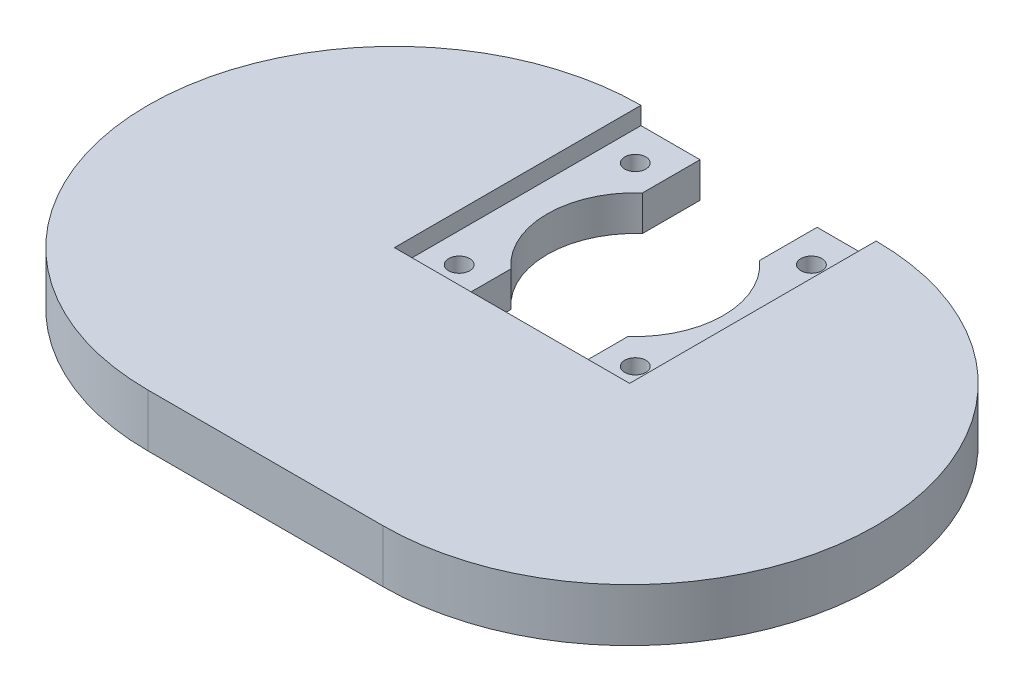
ISO-10303-21;
HEADER;
FILE_DESCRIPTION(('STEP AP214'),'2;1');
FILE_NAME('part.step','',(''),(''),'','','');
FILE_SCHEMA(('AUTOMOTIVE_DESIGN { 1 0 10303 214 1 1 1 1 }'));
ENDSEC;
DATA;
#1=APPLICATION_CONTEXT('core data for automotive mechanical design processes');
#2=APPLICATION_PROTOCOL_DEFINITION('international standard','automotive_design',2000,#1);
#3=PRODUCT_CONTEXT('',#1,'mechanical');
#4=PRODUCT('Part','Part','',(#3));
#5=PRODUCT_RELATED_PRODUCT_CATEGORY('part','',(#4));
#6=PRODUCT_DEFINITION_FORMATION('','',#4);
#7=PRODUCT_DEFINITION_CONTEXT('part definition',#1,'design');
#8=PRODUCT_DEFINITION('design','',#6,#7);
#9=PRODUCT_DEFINITION_SHAPE('','',#8);
#10=(LENGTH_UNIT() NAMED_UNIT(*) SI_UNIT(.MILLI.,.METRE.));
#11=(NAMED_UNIT(*) PLANE_ANGLE_UNIT() SI_UNIT($,.RADIAN.));
#12=(NAMED_UNIT(*) SI_UNIT($,.STERADIAN.) SOLID_ANGLE_UNIT());
#13=UNCERTAINTY_MEASURE_WITH_UNIT(LENGTH_MEASURE(1.E-05),#10,'distance_accuracy_value','');
#14=(GEOMETRIC_REPRESENTATION_CONTEXT(3) GLOBAL_UNCERTAINTY_ASSIGNED_CONTEXT((#13)) GLOBAL_UNIT_ASSIGNED_CONTEXT((#10,
#11,#12)) REPRESENTATION_CONTEXT('',''));
#15=CARTESIAN_POINT('',(0.,0.,0.));
#16=DIRECTION('',(0.,0.,1.));
#17=DIRECTION('',(1.,0.,0.));
#18=AXIS2_PLACEMENT_3D('',#15,#16,#17);
#19=CARTESIAN_POINT('',(-52.7464788732395,-9.99999999999999,-59.4014084507042));
#20=DIRECTION('',(-1.,0.,0.));
#21=DIRECTION('',(0.,0.,1.));
#22=AXIS2_PLACEMENT_3D('',#19,#20,#21);
#23=PLANE('',#22);
#24=DIRECTION('',(0.,0.,1.));
#25=VECTOR('',#24,1.);
#26=CARTESIAN_POINT('',(-52.7464788732395,-9.99999999999999,-59.4014084507042));
#27=LINE('',#26,#25);
#28=CARTESIAN_POINT('',(-52.7464788732395,-9.99999999999999,-5.7258418672672));
#29=VERTEX_POINT('',#28);
#30=CARTESIAN_POINT('',(-52.7464788732395,-9.99999999999998,10.5985915492958));
#31=VERTEX_POINT('',#30);
#32=EDGE_CURVE('E257',#29,#31,#27,.T.);
#33=ORIENTED_EDGE('',*,*,#32,.F.);
#34=DIRECTION('',(0.,1.,0.));
#35=VECTOR('',#34,1.);
#36=CARTESIAN_POINT('',(-52.7464788732395,-11.,-5.72584186726719));
#37=LINE('',#36,#35);
#38=CARTESIAN_POINT('',(-52.7464788732395,0.,-5.7258418672672));
#39=VERTEX_POINT('',#38);
#40=EDGE_CURVE('E11',#29,#39,#37,.T.);
#41=ORIENTED_EDGE('',*,*,#40,.T.);
#42=DIRECTION('',(0.,0.,1.));
#43=VECTOR('',#42,1.);
#44=CARTESIAN_POINT('',(-52.7464788732395,0.,-59.4014084507042));
#45=LINE('',#44,#43);
#46=CARTESIAN_POINT('',(-52.7464788732395,0.,10.5985915492958));
#47=VERTEX_POINT('',#46);
#48=EDGE_CURVE('E264',#39,#47,#45,.T.);
#49=ORIENTED_EDGE('',*,*,#48,.T.);
#50=DIRECTION('',(0.,1.,0.));
#51=VECTOR('',#50,1.);
#52=CARTESIAN_POINT('',(-52.7464788732395,-9.99999999999999,10.5985915492958));
#53=LINE('',#52,#51);
#54=EDGE_CURVE('E259',#31,#47,#53,.T.);
#55=ORIENTED_EDGE('',*,*,#54,.F.);
#56=EDGE_LOOP('',(#33,#41,#49,#55));
#57=FACE_BOUND('',#56,.T.);
#58=ADVANCED_FACE('F43',(#57),#23,.F.);
#59=CARTESIAN_POINT('',(0.,-9.99999999999999,0.));
#60=DIRECTION('',(0.,1.,0.));
#61=DIRECTION('',(0.,0.,1.));
#62=AXIS2_PLACEMENT_3D('',#59,#60,#61);
#63=PLANE('',#62);
#64=DIRECTION('',(-1.,0.,0.));
#65=VECTOR('',#64,1.);
#66=CARTESIAN_POINT('',(-2.74745450733451,-9.99999999999998,10.5985915492958));
#67=LINE('',#66,#65);
#68=CARTESIAN_POINT('',(-19.5080178876162,-9.99999999999998,10.5985915492958));
#69=VERTEX_POINT('',#68);
#70=EDGE_CURVE('E205',#69,#31,#67,.T.);
#71=ORIENTED_EDGE('',*,*,#70,.F.);
#72=DIRECTION('',(0.,0.,1.));
#73=VECTOR('',#72,1.);
#74=CARTESIAN_POINT('',(-19.5080178876162,-9.99999999999998,0.));
#75=LINE('',#74,#73);
#76=CARTESIAN_POINT('',(-19.5080178876162,-9.99999999999998,-5.7258418672672));
#77=VERTEX_POINT('',#76);
#78=EDGE_CURVE('E302',#77,#69,#75,.T.);
#79=ORIENTED_EDGE('',*,*,#78,.F.);
#80=CARTESIAN_POINT('',(-36.1272483804279,-9.99999999999998,-24.4014084507042));
#81=DIRECTION('',(0.,1.,0.));
#82=DIRECTION('',(0.,0.,1.));
#83=AXIS2_PLACEMENT_3D('',#80,#81,#82);
#84=CIRCLE('',#83,24.9995121829525);
#85=CARTESIAN_POINT('',(-19.5080178876162,-9.99999999999998,-43.0769750341412));
#86=VERTEX_POINT('',#85);
#87=EDGE_CURVE('E158',#77,#86,#84,.T.);
#88=ORIENTED_EDGE('',*,*,#87,.T.);
#89=CARTESIAN_POINT('',(-19.5080178876162,-9.99999999999998,-59.4014084507042));
#90=VERTEX_POINT('',#89);
#91=EDGE_CURVE('E166',#90,#86,#75,.T.);
#92=ORIENTED_EDGE('',*,*,#91,.F.);
#93=DIRECTION('',(1.,0.,0.));
#94=VECTOR('',#93,1.);
#95=CARTESIAN_POINT('',(0.,-9.99999999999998,-59.4014084507042));
#96=LINE('',#95,#94);
#97=CARTESIAN_POINT('',(-2.74745450733451,-9.99999999999998,-59.4014084507042));
#98=VERTEX_POINT('',#97);
#99=EDGE_CURVE('E310',#90,#98,#96,.T.);
#100=ORIENTED_EDGE('',*,*,#99,.T.);
#101=CARTESIAN_POINT('',(-2.74745450733451,-9.99999999999998,10.5985915492958));
#102=DIRECTION('',(0.,-1.,0.));
#103=DIRECTION('',(0.,0.,-1.));
#104=AXIS2_PLACEMENT_3D('',#101,#102,#103);
#105=CIRCLE('',#104,70.);
#106=CARTESIAN_POINT('',(-2.7474545073345,-9.99999999999998,80.5985915492958));
#107=VERTEX_POINT('',#106);
#108=EDGE_CURVE('E202',#98,#107,#105,.T.);
#109=ORIENTED_EDGE('',*,*,#108,.T.);
#110=DIRECTION('',(1.,0.,0.));
#111=VECTOR('',#110,1.);
#112=CARTESIAN_POINT('',(-69.5070422535212,-9.99999999999998,80.5985915492958));
#113=LINE('',#112,#111);
#114=CARTESIAN_POINT('',(-69.5070422535212,-9.99999999999998,80.5985915492958));
#115=VERTEX_POINT('',#114);
#116=EDGE_CURVE('E199',#115,#107,#113,.T.);
#117=ORIENTED_EDGE('',*,*,#116,.F.);
#118=CARTESIAN_POINT('',(-69.5070422535212,-9.99999999999998,10.5985915492958));
#119=DIRECTION('',(0.,1.,0.));
#120=DIRECTION('',(0.,0.,1.));
#121=AXIS2_PLACEMENT_3D('',#118,#119,#120);
#122=CIRCLE('',#121,70.);
#123=CARTESIAN_POINT('',(-69.5070422535212,-9.99999999999999,-59.4014084507042));
#124=VERTEX_POINT('',#123);
#125=EDGE_CURVE('E189',#124,#115,#122,.T.);
#126=ORIENTED_EDGE('',*,*,#125,.F.);
#127=DIRECTION('',(1.,0.,0.));
#128=VECTOR('',#127,1.);
#129=CARTESIAN_POINT('',(-69.5070422535212,-9.99999999999999,-59.4014084507042));
#130=LINE('',#129,#128);
#131=CARTESIAN_POINT('',(-52.7464788732395,-9.99999999999999,-59.4014084507042));
#132=VERTEX_POINT('',#131);
#133=EDGE_CURVE('E256',#124,#132,#130,.T.);
#134=ORIENTED_EDGE('',*,*,#133,.T.);
#135=CARTESIAN_POINT('',(-52.7464788732395,-9.99999999999999,-43.0769750341412));
#136=VERTEX_POINT('',#135);
#137=EDGE_CURVE('E253',#132,#136,#27,.T.);
#138=ORIENTED_EDGE('',*,*,#137,.T.);
#139=CARTESIAN_POINT('',(-36.1272483804279,-9.99999999999999,-24.4014084507042));
#140=DIRECTION('',(0.,1.,0.));
#141=DIRECTION('',(0.,0.,1.));
#142=AXIS2_PLACEMENT_3D('',#139,#140,#141);
#143=CIRCLE('',#142,24.9995121829525);
#144=EDGE_CURVE('E66',#136,#29,#143,.T.);
#145=ORIENTED_EDGE('',*,*,#144,.T.);
#146=ORIENTED_EDGE('',*,*,#32,.T.);
#147=EDGE_LOOP('',(#71,#79,#88,#92,#100,#109,#117,#126,#134,#138,#145,#146));
#148=FACE_BOUND('',#147,.T.);
#149=CARTESIAN_POINT('',(-61.1267605633804,-9.99999999999999,0.598591549295778));
#150=DIRECTION('',(0.,1.,0.));
#151=DIRECTION('',(0.,0.,1.));
#152=AXIS2_PLACEMENT_3D('',#149,#150,#151);
#153=CIRCLE('',#152,3.);
#154=CARTESIAN_POINT('',(-61.1267605633804,-9.99999999999999,3.59859154929578));
#155=VERTEX_POINT('',#154);
#156=EDGE_CURVE('E244',#155,#155,#153,.F.);
#157=ORIENTED_EDGE('',*,*,#156,.F.);
#158=EDGE_LOOP('',(#157));
#159=FACE_BOUND('',#158,.T.);
#160=CARTESIAN_POINT('',(-61.1267605633804,-9.99999999999999,-49.4014084507042));
#161=DIRECTION('',(0.,1.,0.));
#162=DIRECTION('',(0.,0.,1.));
#163=AXIS2_PLACEMENT_3D('',#160,#161,#162);
#164=CIRCLE('',#163,3.);
#165=CARTESIAN_POINT('',(-61.1267605633804,-9.99999999999999,-46.4014084507042));
#166=VERTEX_POINT('',#165);
#167=EDGE_CURVE('E249',#166,#166,#164,.T.);
#168=ORIENTED_EDGE('',*,*,#167,.T.);
#169=EDGE_LOOP('',(#168));
#170=FACE_BOUND('',#169,.T.);
#171=CARTESIAN_POINT('',(-11.1277361974754,-9.99999999999998,0.598591549295778));
#172=DIRECTION('',(0.,1.,0.));
#173=DIRECTION('',(0.,0.,1.));
#174=AXIS2_PLACEMENT_3D('',#171,#172,#173);
#175=CIRCLE('',#174,3.);
#176=CARTESIAN_POINT('',(-11.1277361974754,-9.99999999999998,3.59859154929578));
#177=VERTEX_POINT('',#176);
#178=EDGE_CURVE('E186',#177,#177,#175,.F.);
#179=ORIENTED_EDGE('',*,*,#178,.F.);
#180=EDGE_LOOP('',(#179));
#181=FACE_BOUND('',#180,.T.);
#182=CARTESIAN_POINT('',(-11.1277361974754,-9.99999999999998,-49.4014084507042));
#183=DIRECTION('',(0.,1.,0.));
#184=DIRECTION('',(0.,0.,1.));
#185=AXIS2_PLACEMENT_3D('',#182,#183,#184);
#186=CIRCLE('',#185,3.);
#187=CARTESIAN_POINT('',(-11.1277361974754,-9.99999999999998,-46.4014084507042));
#188=VERTEX_POINT('',#187);
#189=EDGE_CURVE('E196',#188,#188,#186,.T.);
#190=ORIENTED_EDGE('',*,*,#189,.T.);
#191=EDGE_LOOP('',(#190));
#192=FACE_BOUND('',#191,.T.);
#193=ADVANCED_FACE('F282',(#148,#159,#170,#181,#192),#63,.F.);
#194=CARTESIAN_POINT('',(0.,0.,0.));
#195=DIRECTION('',(0.,1.,0.));
#196=DIRECTION('',(0.,0.,1.));
#197=AXIS2_PLACEMENT_3D('',#194,#195,#196);
#198=PLANE('',#197);
#199=CARTESIAN_POINT('',(-36.1272483804279,0.,-24.4014084507042));
#200=DIRECTION('',(0.,1.,0.));
#201=DIRECTION('',(0.,0.,1.));
#202=AXIS2_PLACEMENT_3D('',#199,#200,#201);
#203=CIRCLE('',#202,24.9995121829525);
#204=CARTESIAN_POINT('',(-52.7464788732395,0.,-43.0769750341412));
#205=VERTEX_POINT('',#204);
#206=EDGE_CURVE('E237',#205,#39,#203,.T.);
#207=ORIENTED_EDGE('',*,*,#206,.F.);
#208=CARTESIAN_POINT('',(-52.7464788732395,0.,-59.4014084507042));
#209=VERTEX_POINT('',#208);
#210=EDGE_CURVE('E265',#209,#205,#45,.T.);
#211=ORIENTED_EDGE('',*,*,#210,.F.);
#212=DIRECTION('',(1.,0.,0.));
#213=VECTOR('',#212,1.);
#214=CARTESIAN_POINT('',(-69.5070422535212,0.,-59.4014084507042));
#215=LINE('',#214,#213);
#216=CARTESIAN_POINT('',(-69.5070422535212,0.,-59.4014084507042));
#217=VERTEX_POINT('',#216);
#218=EDGE_CURVE('E268',#217,#209,#215,.T.);
#219=ORIENTED_EDGE('',*,*,#218,.F.);
#220=DIRECTION('',(0.,0.,1.));
#221=VECTOR('',#220,1.);
#222=CARTESIAN_POINT('',(-69.5070422535212,0.,-59.4014084507042));
#223=LINE('',#222,#221);
#224=CARTESIAN_POINT('',(-69.5070422535212,0.,10.5985915492958));
#225=VERTEX_POINT('',#224);
#226=EDGE_CURVE('E252',#217,#225,#223,.T.);
#227=ORIENTED_EDGE('',*,*,#226,.T.);
#228=DIRECTION('',(1.,0.,0.));
#229=VECTOR('',#228,1.);
#230=CARTESIAN_POINT('',(-69.5070422535212,0.,10.5985915492958));
#231=LINE('',#230,#229);
#232=EDGE_CURVE('E261',#225,#47,#231,.T.);
#233=ORIENTED_EDGE('',*,*,#232,.T.);
#234=ORIENTED_EDGE('',*,*,#48,.F.);
#235=EDGE_LOOP('',(#207,#211,#219,#227,#233,#234));
#236=FACE_BOUND('',#235,.T.);
#237=CARTESIAN_POINT('',(-61.1267605633804,0.,0.598591549295778));
#238=DIRECTION('',(0.,-1.,0.));
#239=DIRECTION('',(0.,0.,-1.));
#240=AXIS2_PLACEMENT_3D('',#237,#238,#239);
#241=CIRCLE('',#240,3.);
#242=CARTESIAN_POINT('',(-61.1267605633804,0.,-2.40140845070422));
#243=VERTEX_POINT('',#242);
#244=EDGE_CURVE('E240',#243,#243,#241,.T.);
#245=ORIENTED_EDGE('',*,*,#244,.T.);
#246=EDGE_LOOP('',(#245));
#247=FACE_BOUND('',#246,.T.);
#248=CARTESIAN_POINT('',(-61.1267605633804,0.,-49.4014084507042));
#249=DIRECTION('',(0.,1.,0.));
#250=DIRECTION('',(0.,0.,1.));
#251=AXIS2_PLACEMENT_3D('',#248,#249,#250);
#252=CIRCLE('',#251,3.);
#253=CARTESIAN_POINT('',(-61.1267605633804,0.,-46.4014084507042));
#254=VERTEX_POINT('',#253);
#255=EDGE_CURVE('E241',#254,#254,#252,.T.);
#256=ORIENTED_EDGE('',*,*,#255,.F.);
#257=EDGE_LOOP('',(#256));
#258=FACE_BOUND('',#257,.T.);
#259=ADVANCED_FACE('F294',(#236,#247,#258),#198,.T.);
#260=CARTESIAN_POINT('',(-69.5070422535212,-9.99999999999999,-59.4014084507042));
#261=DIRECTION('',(0.,0.,1.));
#262=DIRECTION('',(1.,0.,0.));
#263=AXIS2_PLACEMENT_3D('',#260,#261,#262);
#264=PLANE('',#263);
#265=ORIENTED_EDGE('',*,*,#218,.T.);
#266=DIRECTION('',(0.,1.,0.));
#267=VECTOR('',#266,1.);
#268=CARTESIAN_POINT('',(-52.7464788732395,-9.99999999999999,-59.4014084507042));
#269=LINE('',#268,#267);
#270=EDGE_CURVE('E272',#132,#209,#269,.T.);
#271=ORIENTED_EDGE('',*,*,#270,.F.);
#272=ORIENTED_EDGE('',*,*,#133,.F.);
#273=DIRECTION('',(0.,1.,0.));
#274=VECTOR('',#273,1.);
#275=CARTESIAN_POINT('',(-69.5070422535212,-9.99999999999999,-59.4014084507042));
#276=LINE('',#275,#274);
#277=EDGE_CURVE('E270',#124,#217,#276,.T.);
#278=ORIENTED_EDGE('',*,*,#277,.T.);
#279=EDGE_LOOP('',(#265,#271,#272,#278));
#280=FACE_BOUND('',#279,.T.);
#281=ADVANCED_FACE('F291',(#280),#264,.F.);
#282=ORIENTED_EDGE('',*,*,#210,.T.);
#283=DIRECTION('',(0.,1.,0.));
#284=VECTOR('',#283,1.);
#285=CARTESIAN_POINT('',(-52.7464788732395,-11.,-43.0769750341412));
#286=LINE('',#285,#284);
#287=EDGE_CURVE('E51',#205,#136,#286,.F.);
#288=ORIENTED_EDGE('',*,*,#287,.T.);
#289=ORIENTED_EDGE('',*,*,#137,.F.);
#290=ORIENTED_EDGE('',*,*,#270,.T.);
#291=EDGE_LOOP('',(#282,#288,#289,#290));
#292=FACE_BOUND('',#291,.T.);
#293=ADVANCED_FACE('F45',(#292),#23,.F.);
#294=CARTESIAN_POINT('',(-61.1267605633804,-20.,0.598591549295778));
#295=DIRECTION('',(0.,1.,0.));
#296=DIRECTION('',(0.,0.,1.));
#297=AXIS2_PLACEMENT_3D('',#294,#295,#296);
#298=CYLINDRICAL_SURFACE('',#297,3.);
#299=ORIENTED_EDGE('',*,*,#244,.F.);
#300=EDGE_LOOP('',(#299));
#301=FACE_BOUND('',#300,.T.);
#302=ORIENTED_EDGE('',*,*,#156,.T.);
#303=EDGE_LOOP('',(#302));
#304=FACE_BOUND('',#303,.T.);
#305=ADVANCED_FACE('F338',(#301,#304),#298,.F.);
#306=CARTESIAN_POINT('',(-61.1267605633804,-20.,-49.4014084507042));
#307=DIRECTION('',(0.,1.,0.));
#308=DIRECTION('',(0.,0.,1.));
#309=AXIS2_PLACEMENT_3D('',#306,#307,#308);
#310=CYLINDRICAL_SURFACE('',#309,3.);
#311=ORIENTED_EDGE('',*,*,#255,.T.);
#312=EDGE_LOOP('',(#311));
#313=FACE_BOUND('',#312,.T.);
#314=ORIENTED_EDGE('',*,*,#167,.F.);
#315=EDGE_LOOP('',(#314));
#316=FACE_BOUND('',#315,.T.);
#317=ADVANCED_FACE('F343',(#313,#316),#310,.F.);
#318=CARTESIAN_POINT('',(-36.1272483804279,-11.,-24.4014084507042));
#319=DIRECTION('',(0.,1.,0.));
#320=DIRECTION('',(0.,0.,1.));
#321=AXIS2_PLACEMENT_3D('',#318,#319,#320);
#322=CYLINDRICAL_SURFACE('',#321,24.9995121829525);
#323=ORIENTED_EDGE('',*,*,#144,.F.);
#324=ORIENTED_EDGE('',*,*,#287,.F.);
#325=ORIENTED_EDGE('',*,*,#206,.T.);
#326=ORIENTED_EDGE('',*,*,#40,.F.);
#327=EDGE_LOOP('',(#323,#324,#325,#326));
#328=FACE_BOUND('',#327,.T.);
#329=ADVANCED_FACE('F298',(#328),#322,.F.);
#330=CARTESIAN_POINT('',(-52.7464788732395,4.99999999999998,10.5985915492958));
#331=DIRECTION('',(0.,0.,1.));
#332=DIRECTION('',(1.,0.,0.));
#333=AXIS2_PLACEMENT_3D('',#330,#331,#332);
#334=PLANE('',#333);
#335=DIRECTION('',(1.,0.,0.));
#336=VECTOR('',#335,1.);
#337=CARTESIAN_POINT('',(0.,0.,10.5985915492958));
#338=LINE('',#337,#336);
#339=CARTESIAN_POINT('',(-19.5080178876162,0.,10.5985915492958));
#340=VERTEX_POINT('',#339);
#341=CARTESIAN_POINT('',(-2.74745450733451,0.,10.5985915492958));
#342=VERTEX_POINT('',#341);
#343=EDGE_CURVE('E58',#340,#342,#338,.T.);
#344=ORIENTED_EDGE('',*,*,#343,.F.);
#345=DIRECTION('',(0.,1.,0.));
#346=VECTOR('',#345,1.);
#347=CARTESIAN_POINT('',(-19.5080178876162,-9.99999999999998,10.5985915492958));
#348=LINE('',#347,#346);
#349=EDGE_CURVE('E193',#69,#340,#348,.T.);
#350=ORIENTED_EDGE('',*,*,#349,.F.);
#351=ORIENTED_EDGE('',*,*,#70,.T.);
#352=ORIENTED_EDGE('',*,*,#54,.T.);
#353=ORIENTED_EDGE('',*,*,#232,.F.);
#354=DIRECTION('',(0.,-1.,0.));
#355=VECTOR('',#354,1.);
#356=CARTESIAN_POINT('',(-69.5070422535212,4.99999999999998,10.5985915492958));
#357=LINE('',#356,#355);
#358=CARTESIAN_POINT('',(-69.5070422535212,4.99999999999998,10.5985915492958));
#359=VERTEX_POINT('',#358);
#360=EDGE_CURVE('E224',#359,#225,#357,.T.);
#361=ORIENTED_EDGE('',*,*,#360,.F.);
#362=DIRECTION('',(-1.,0.,0.));
#363=VECTOR('',#362,1.);
#364=CARTESIAN_POINT('',(-2.74745450733451,4.99999999999998,10.5985915492958));
#365=LINE('',#364,#363);
#366=CARTESIAN_POINT('',(-2.74745450733451,4.99999999999998,10.5985915492958));
#367=VERTEX_POINT('',#366);
#368=EDGE_CURVE('E217',#367,#359,#365,.T.);
#369=ORIENTED_EDGE('',*,*,#368,.F.);
#370=DIRECTION('',(0.,-1.,0.));
#371=VECTOR('',#370,1.);
#372=CARTESIAN_POINT('',(-2.74745450733451,4.99999999999998,10.5985915492958));
#373=LINE('',#372,#371);
#374=EDGE_CURVE('E227',#367,#342,#373,.T.);
#375=ORIENTED_EDGE('',*,*,#374,.T.);
#376=EDGE_LOOP('',(#344,#350,#351,#352,#353,#361,#369,#375));
#377=FACE_BOUND('',#376,.T.);
#378=ADVANCED_FACE('F305',(#377),#334,.F.);
#379=CARTESIAN_POINT('',(-69.5070422535212,4.99999999999998,10.5985915492958));
#380=DIRECTION('',(0.,-1.,0.));
#381=DIRECTION('',(0.,0.,-1.));
#382=AXIS2_PLACEMENT_3D('',#379,#380,#381);
#383=CYLINDRICAL_SURFACE('',#382,70.);
#384=DIRECTION('',(0.,-1.,0.));
#385=VECTOR('',#384,1.);
#386=CARTESIAN_POINT('',(-69.5070422535212,4.99999999999998,-59.4014084507042));
#387=LINE('',#386,#385);
#388=CARTESIAN_POINT('',(-69.5070422535212,4.99999999999998,-59.4014084507042));
#389=VERTEX_POINT('',#388);
#390=EDGE_CURVE('E221',#389,#217,#387,.T.);
#391=ORIENTED_EDGE('',*,*,#390,.T.);
#392=ORIENTED_EDGE('',*,*,#277,.F.);
#393=ORIENTED_EDGE('',*,*,#125,.T.);
#394=DIRECTION('',(0.,-1.,0.));
#395=VECTOR('',#394,1.);
#396=CARTESIAN_POINT('',(-69.5070422535212,4.99999999999998,80.5985915492958));
#397=LINE('',#396,#395);
#398=CARTESIAN_POINT('',(-69.5070422535212,4.99999999999998,80.5985915492958));
#399=VERTEX_POINT('',#398);
#400=EDGE_CURVE('E235',#399,#115,#397,.T.);
#401=ORIENTED_EDGE('',*,*,#400,.F.);
#402=CARTESIAN_POINT('',(-69.5070422535212,4.99999999999998,10.5985915492958));
#403=DIRECTION('',(0.,1.,0.));
#404=DIRECTION('',(0.,0.,1.));
#405=AXIS2_PLACEMENT_3D('',#402,#403,#404);
#406=CIRCLE('',#405,70.);
#407=EDGE_CURVE('E207',#389,#399,#406,.T.);
#408=ORIENTED_EDGE('',*,*,#407,.F.);
#409=EDGE_LOOP('',(#391,#392,#393,#401,#408));
#410=FACE_BOUND('',#409,.T.);
#411=ADVANCED_FACE('F356',(#410),#383,.T.);
#412=CARTESIAN_POINT('',(-69.5070422535212,4.99999999999998,80.5985915492958));
#413=DIRECTION('',(0.,0.,-1.));
#414=DIRECTION('',(-1.,0.,0.));
#415=AXIS2_PLACEMENT_3D('',#412,#413,#414);
#416=PLANE('',#415);
#417=ORIENTED_EDGE('',*,*,#400,.T.);
#418=ORIENTED_EDGE('',*,*,#116,.T.);
#419=DIRECTION('',(0.,-1.,0.));
#420=VECTOR('',#419,1.);
#421=CARTESIAN_POINT('',(-2.7474545073345,4.99999999999998,80.5985915492958));
#422=LINE('',#421,#420);
#423=CARTESIAN_POINT('',(-2.7474545073345,4.99999999999998,80.5985915492958));
#424=VERTEX_POINT('',#423);
#425=EDGE_CURVE('E233',#424,#107,#422,.T.);
#426=ORIENTED_EDGE('',*,*,#425,.F.);
#427=DIRECTION('',(1.,0.,0.));
#428=VECTOR('',#427,1.);
#429=CARTESIAN_POINT('',(-69.5070422535212,4.99999999999998,80.5985915492958));
#430=LINE('',#429,#428);
#431=EDGE_CURVE('E210',#399,#424,#430,.T.);
#432=ORIENTED_EDGE('',*,*,#431,.F.);
#433=EDGE_LOOP('',(#417,#418,#426,#432));
#434=FACE_BOUND('',#433,.T.);
#435=ADVANCED_FACE('F359',(#434),#416,.F.);
#436=CARTESIAN_POINT('',(-2.74745450733451,4.99999999999998,10.5985915492958));
#437=DIRECTION('',(0.,-1.,0.));
#438=DIRECTION('',(0.,0.,-1.));
#439=AXIS2_PLACEMENT_3D('',#436,#437,#438);
#440=CYLINDRICAL_SURFACE('',#439,70.);
#441=ORIENTED_EDGE('',*,*,#425,.T.);
#442=ORIENTED_EDGE('',*,*,#108,.F.);
#443=DIRECTION('',(0.,1.,0.));
#444=VECTOR('',#443,1.);
#445=CARTESIAN_POINT('',(-2.74745450733451,-9.99999999999998,-59.4014084507042));
#446=LINE('',#445,#444);
#447=CARTESIAN_POINT('',(-2.74745450733451,0.,-59.4014084507042));
#448=VERTEX_POINT('',#447);
#449=EDGE_CURVE('E190',#98,#448,#446,.T.);
#450=ORIENTED_EDGE('',*,*,#449,.T.);
#451=DIRECTION('',(0.,-1.,0.));
#452=VECTOR('',#451,1.);
#453=CARTESIAN_POINT('',(-2.74745450733451,4.99999999999998,-59.4014084507042));
#454=LINE('',#453,#452);
#455=CARTESIAN_POINT('',(-2.74745450733451,4.99999999999998,-59.4014084507042));
#456=VERTEX_POINT('',#455);
#457=EDGE_CURVE('E230',#456,#448,#454,.T.);
#458=ORIENTED_EDGE('',*,*,#457,.F.);
#459=CARTESIAN_POINT('',(-2.74745450733451,4.99999999999998,10.5985915492958));
#460=DIRECTION('',(0.,-1.,0.));
#461=DIRECTION('',(0.,0.,-1.));
#462=AXIS2_PLACEMENT_3D('',#459,#460,#461);
#463=CIRCLE('',#462,70.);
#464=EDGE_CURVE('E212',#456,#424,#463,.T.);
#465=ORIENTED_EDGE('',*,*,#464,.T.);
#466=EDGE_LOOP('',(#441,#442,#450,#458,#465));
#467=FACE_BOUND('',#466,.T.);
#468=ADVANCED_FACE('F363',(#467),#440,.T.);
#469=CARTESIAN_POINT('',(-2.74745450733451,4.99999999999998,-59.4014084507042));
#470=DIRECTION('',(1.,0.,0.));
#471=DIRECTION('',(0.,0.,-1.));
#472=AXIS2_PLACEMENT_3D('',#469,#470,#471);
#473=PLANE('',#472);
#474=ORIENTED_EDGE('',*,*,#457,.T.);
#475=DIRECTION('',(0.,0.,1.));
#476=VECTOR('',#475,1.);
#477=CARTESIAN_POINT('',(-2.74745450733451,0.,0.));
#478=LINE('',#477,#476);
#479=EDGE_CURVE('E175',#448,#342,#478,.T.);
#480=ORIENTED_EDGE('',*,*,#479,.T.);
#481=ORIENTED_EDGE('',*,*,#374,.F.);
#482=DIRECTION('',(0.,0.,1.));
#483=VECTOR('',#482,1.);
#484=CARTESIAN_POINT('',(-2.74745450733451,4.99999999999998,-59.4014084507042));
#485=LINE('',#484,#483);
#486=EDGE_CURVE('E215',#456,#367,#485,.T.);
#487=ORIENTED_EDGE('',*,*,#486,.F.);
#488=EDGE_LOOP('',(#474,#480,#481,#487));
#489=FACE_BOUND('',#488,.T.);
#490=ADVANCED_FACE('F367',(#489),#473,.F.);
#491=CARTESIAN_POINT('',(-69.5070422535212,4.99999999999998,10.5985915492958));
#492=DIRECTION('',(-1.,0.,0.));
#493=DIRECTION('',(0.,0.,1.));
#494=AXIS2_PLACEMENT_3D('',#491,#492,#493);
#495=PLANE('',#494);
#496=ORIENTED_EDGE('',*,*,#226,.F.);
#497=ORIENTED_EDGE('',*,*,#390,.F.);
#498=DIRECTION('',(0.,0.,-1.));
#499=VECTOR('',#498,1.);
#500=CARTESIAN_POINT('',(-69.5070422535212,4.99999999999998,10.5985915492958));
#501=LINE('',#500,#499);
#502=EDGE_CURVE('E219',#359,#389,#501,.T.);
#503=ORIENTED_EDGE('',*,*,#502,.F.);
#504=ORIENTED_EDGE('',*,*,#360,.T.);
#505=EDGE_LOOP('',(#496,#497,#503,#504));
#506=FACE_BOUND('',#505,.T.);
#507=ADVANCED_FACE('F371',(#506),#495,.F.);
#508=CARTESIAN_POINT('',(-69.5070422535212,4.99999999999998,10.5985915492958));
#509=DIRECTION('',(0.,1.,0.));
#510=DIRECTION('',(0.,0.,1.));
#511=AXIS2_PLACEMENT_3D('',#508,#509,#510);
#512=PLANE('',#511);
#513=ORIENTED_EDGE('',*,*,#407,.T.);
#514=ORIENTED_EDGE('',*,*,#431,.T.);
#515=ORIENTED_EDGE('',*,*,#464,.F.);
#516=ORIENTED_EDGE('',*,*,#486,.T.);
#517=ORIENTED_EDGE('',*,*,#368,.T.);
#518=ORIENTED_EDGE('',*,*,#502,.T.);
#519=EDGE_LOOP('',(#513,#514,#515,#516,#517,#518));
#520=FACE_BOUND('',#519,.T.);
#521=ADVANCED_FACE('F377',(#520),#512,.T.);
#522=CARTESIAN_POINT('',(-19.5080178876162,-9.99999999999998,0.));
#523=DIRECTION('',(-1.,0.,0.));
#524=DIRECTION('',(0.,0.,1.));
#525=AXIS2_PLACEMENT_3D('',#522,#523,#524);
#526=PLANE('',#525);
#527=DIRECTION('',(0.,1.,0.));
#528=VECTOR('',#527,1.);
#529=CARTESIAN_POINT('',(-19.5080178876162,-11.,-5.7258418672672));
#530=LINE('',#529,#528);
#531=CARTESIAN_POINT('',(-19.5080178876162,0.,-5.7258418672672));
#532=VERTEX_POINT('',#531);
#533=EDGE_CURVE('E155',#77,#532,#530,.T.);
#534=ORIENTED_EDGE('',*,*,#533,.F.);
#535=ORIENTED_EDGE('',*,*,#78,.T.);
#536=ORIENTED_EDGE('',*,*,#349,.T.);
#537=DIRECTION('',(0.,0.,1.));
#538=VECTOR('',#537,1.);
#539=CARTESIAN_POINT('',(-19.5080178876162,0.,0.));
#540=LINE('',#539,#538);
#541=EDGE_CURVE('E173',#532,#340,#540,.T.);
#542=ORIENTED_EDGE('',*,*,#541,.F.);
#543=EDGE_LOOP('',(#534,#535,#536,#542));
#544=FACE_BOUND('',#543,.T.);
#545=ADVANCED_FACE('F308',(#544),#526,.T.);
#546=DIRECTION('',(0.,1.,0.));
#547=VECTOR('',#546,1.);
#548=CARTESIAN_POINT('',(-19.5080178876162,-11.,-43.0769750341412));
#549=LINE('',#548,#547);
#550=CARTESIAN_POINT('',(-19.5080178876162,0.,-43.0769750341412));
#551=VERTEX_POINT('',#550);
#552=EDGE_CURVE('E152',#551,#86,#549,.F.);
#553=ORIENTED_EDGE('',*,*,#552,.F.);
#554=CARTESIAN_POINT('',(-19.5080178876162,0.,-59.4014084507042));
#555=VERTEX_POINT('',#554);
#556=EDGE_CURVE('E164',#555,#551,#540,.T.);
#557=ORIENTED_EDGE('',*,*,#556,.F.);
#558=DIRECTION('',(0.,1.,0.));
#559=VECTOR('',#558,1.);
#560=CARTESIAN_POINT('',(-19.5080178876162,-9.99999999999998,-59.4014084507042));
#561=LINE('',#560,#559);
#562=EDGE_CURVE('E187',#90,#555,#561,.T.);
#563=ORIENTED_EDGE('',*,*,#562,.F.);
#564=ORIENTED_EDGE('',*,*,#91,.T.);
#565=EDGE_LOOP('',(#553,#557,#563,#564));
#566=FACE_BOUND('',#565,.T.);
#567=ADVANCED_FACE('F163',(#566),#526,.T.);
#568=CARTESIAN_POINT('',(0.,-9.99999999999998,-59.4014084507042));
#569=DIRECTION('',(0.,0.,1.));
#570=DIRECTION('',(1.,0.,0.));
#571=AXIS2_PLACEMENT_3D('',#568,#569,#570);
#572=PLANE('',#571);
#573=DIRECTION('',(1.,0.,0.));
#574=VECTOR('',#573,1.);
#575=CARTESIAN_POINT('',(0.,0.,-59.4014084507042));
#576=LINE('',#575,#574);
#577=EDGE_CURVE('E172',#555,#448,#576,.T.);
#578=ORIENTED_EDGE('',*,*,#577,.T.);
#579=ORIENTED_EDGE('',*,*,#449,.F.);
#580=ORIENTED_EDGE('',*,*,#99,.F.);
#581=ORIENTED_EDGE('',*,*,#562,.T.);
#582=EDGE_LOOP('',(#578,#579,#580,#581));
#583=FACE_BOUND('',#582,.T.);
#584=ADVANCED_FACE('F384',(#583),#572,.F.);
#585=CARTESIAN_POINT('',(-11.1277361974754,-9.99999999999998,0.598591549295778));
#586=DIRECTION('',(0.,1.,0.));
#587=DIRECTION('',(0.,0.,1.));
#588=AXIS2_PLACEMENT_3D('',#585,#586,#587);
#589=CYLINDRICAL_SURFACE('',#588,3.);
#590=ORIENTED_EDGE('',*,*,#178,.T.);
#591=EDGE_LOOP('',(#590));
#592=FACE_BOUND('',#591,.T.);
#593=CARTESIAN_POINT('',(-11.1277361974754,0.,0.598591549295778));
#594=DIRECTION('',(0.,1.,0.));
#595=DIRECTION('',(0.,0.,1.));
#596=AXIS2_PLACEMENT_3D('',#593,#594,#595);
#597=CIRCLE('',#596,3.);
#598=CARTESIAN_POINT('',(-11.1277361974754,0.,3.59859154929578));
#599=VERTEX_POINT('',#598);
#600=EDGE_CURVE('E177',#599,#599,#597,.F.);
#601=ORIENTED_EDGE('',*,*,#600,.F.);
#602=EDGE_LOOP('',(#601));
#603=FACE_BOUND('',#602,.T.);
#604=ADVANCED_FACE('F322',(#592,#603),#589,.F.);
#605=CARTESIAN_POINT('',(-11.1277361974754,-9.99999999999998,-49.4014084507042));
#606=DIRECTION('',(0.,1.,0.));
#607=DIRECTION('',(0.,0.,1.));
#608=AXIS2_PLACEMENT_3D('',#605,#606,#607);
#609=CYLINDRICAL_SURFACE('',#608,3.);
#610=ORIENTED_EDGE('',*,*,#189,.F.);
#611=EDGE_LOOP('',(#610));
#612=FACE_BOUND('',#611,.T.);
#613=CARTESIAN_POINT('',(-11.1277361974754,0.,-49.4014084507042));
#614=DIRECTION('',(0.,1.,0.));
#615=DIRECTION('',(0.,0.,1.));
#616=AXIS2_PLACEMENT_3D('',#613,#614,#615);
#617=CIRCLE('',#616,3.);
#618=CARTESIAN_POINT('',(-11.1277361974754,0.,-46.4014084507042));
#619=VERTEX_POINT('',#618);
#620=EDGE_CURVE('E183',#619,#619,#617,.T.);
#621=ORIENTED_EDGE('',*,*,#620,.T.);
#622=EDGE_LOOP('',(#621));
#623=FACE_BOUND('',#622,.T.);
#624=ADVANCED_FACE('F319',(#612,#623),#609,.F.);
#625=CARTESIAN_POINT('',(0.,0.,0.));
#626=DIRECTION('',(0.,1.,0.));
#627=DIRECTION('',(0.,0.,1.));
#628=AXIS2_PLACEMENT_3D('',#625,#626,#627);
#629=PLANE('',#628);
#630=CARTESIAN_POINT('',(-36.1272483804279,0.,-24.4014084507042));
#631=DIRECTION('',(0.,1.,0.));
#632=DIRECTION('',(0.,0.,1.));
#633=AXIS2_PLACEMENT_3D('',#630,#631,#632);
#634=CIRCLE('',#633,24.9995121829525);
#635=EDGE_CURVE('E149',#532,#551,#634,.T.);
#636=ORIENTED_EDGE('',*,*,#635,.F.);
#637=ORIENTED_EDGE('',*,*,#541,.T.);
#638=ORIENTED_EDGE('',*,*,#343,.T.);
#639=ORIENTED_EDGE('',*,*,#479,.F.);
#640=ORIENTED_EDGE('',*,*,#577,.F.);
#641=ORIENTED_EDGE('',*,*,#556,.T.);
#642=EDGE_LOOP('',(#636,#637,#638,#639,#640,#641));
#643=FACE_BOUND('',#642,.T.);
#644=ORIENTED_EDGE('',*,*,#600,.T.);
#645=EDGE_LOOP('',(#644));
#646=FACE_BOUND('',#645,.T.);
#647=ORIENTED_EDGE('',*,*,#620,.F.);
#648=EDGE_LOOP('',(#647));
#649=FACE_BOUND('',#648,.T.);
#650=ADVANCED_FACE('F169',(#643,#646,#649),#629,.T.);
#651=CARTESIAN_POINT('',(-36.1272483804279,-11.,-24.4014084507042));
#652=DIRECTION('',(0.,1.,0.));
#653=DIRECTION('',(0.,0.,1.));
#654=AXIS2_PLACEMENT_3D('',#651,#652,#653);
#655=CYLINDRICAL_SURFACE('',#654,24.9995121829525);
#656=ORIENTED_EDGE('',*,*,#533,.T.);
#657=ORIENTED_EDGE('',*,*,#635,.T.);
#658=ORIENTED_EDGE('',*,*,#552,.T.);
#659=ORIENTED_EDGE('',*,*,#87,.F.);
#660=EDGE_LOOP('',(#656,#657,#658,#659));
#661=FACE_BOUND('',#660,.T.);
#662=ADVANCED_FACE('F151',(#661),#655,.F.);
#663=CLOSED_SHELL('',(#58,#193,#259,#281,#293,#305,#317,#329,#378,#411,#435,#468,#490,#507,#521,
#545,#567,#584,#604,#624,#650,#662));
#664=MANIFOLD_SOLID_BREP('B2',#663);
#665=ADVANCED_BREP_SHAPE_REPRESENTATION('',(#18,#664),#14);
#666=SHAPE_DEFINITION_REPRESENTATION(#9,#665);
ENDSEC;
END-ISO-10303-21;
